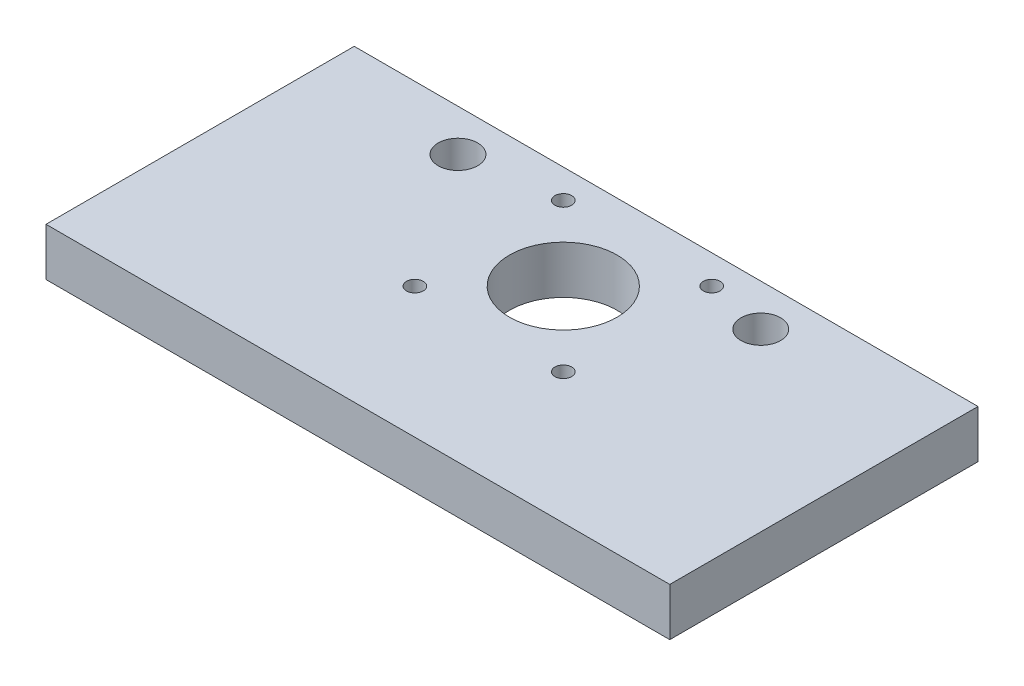
ISO-10303-21;
HEADER;
FILE_DESCRIPTION(('STEP AP214'),'2;1');
FILE_NAME('part.step','',(''),(''),'','','');
FILE_SCHEMA(('AUTOMOTIVE_DESIGN { 1 0 10303 214 1 1 1 1 }'));
ENDSEC;
DATA;
#1=APPLICATION_CONTEXT('core data for automotive mechanical design processes');
#2=APPLICATION_PROTOCOL_DEFINITION('international standard','automotive_design',2000,#1);
#3=PRODUCT_CONTEXT('',#1,'mechanical');
#4=PRODUCT('Part','Part','',(#3));
#5=PRODUCT_RELATED_PRODUCT_CATEGORY('part','',(#4));
#6=PRODUCT_DEFINITION_FORMATION('','',#4);
#7=PRODUCT_DEFINITION_CONTEXT('part definition',#1,'design');
#8=PRODUCT_DEFINITION('design','',#6,#7);
#9=PRODUCT_DEFINITION_SHAPE('','',#8);
#10=(LENGTH_UNIT() NAMED_UNIT(*) SI_UNIT(.MILLI.,.METRE.));
#11=(NAMED_UNIT(*) PLANE_ANGLE_UNIT() SI_UNIT($,.RADIAN.));
#12=(NAMED_UNIT(*) SI_UNIT($,.STERADIAN.) SOLID_ANGLE_UNIT());
#13=UNCERTAINTY_MEASURE_WITH_UNIT(LENGTH_MEASURE(1.E-05),#10,'distance_accuracy_value','');
#14=(GEOMETRIC_REPRESENTATION_CONTEXT(3) GLOBAL_UNCERTAINTY_ASSIGNED_CONTEXT((#13)) GLOBAL_UNIT_ASSIGNED_CONTEXT((#10,
#11,#12)) REPRESENTATION_CONTEXT('',''));
#15=CARTESIAN_POINT('',(0.,0.,0.));
#16=DIRECTION('',(0.,0.,1.));
#17=DIRECTION('',(1.,0.,0.));
#18=AXIS2_PLACEMENT_3D('',#15,#16,#17);
#19=CARTESIAN_POINT('',(0.,10.,-64.3890688986506));
#20=DIRECTION('',(0.,-1.,0.));
#21=DIRECTION('',(0.,0.,-1.));
#22=AXIS2_PLACEMENT_3D('',#19,#20,#21);
#23=PLANE('',#22);
#24=CARTESIAN_POINT('',(30.3812663961431,10.,-55.6797693556538));
#25=DIRECTION('',(0.,1.,0.));
#26=DIRECTION('',(0.,0.,1.));
#27=AXIS2_PLACEMENT_3D('',#24,#25,#26);
#28=CIRCLE('',#27,4.13181922048026);
#29=CARTESIAN_POINT('',(30.3812663961431,10.,-51.5479501351735));
#30=VERTEX_POINT('',#29);
#31=EDGE_CURVE('E137',#30,#30,#28,.T.);
#32=ORIENTED_EDGE('',*,*,#31,.F.);
#33=EDGE_LOOP('',(#32));
#34=FACE_BOUND('',#33,.T.);
#35=CARTESIAN_POINT('',(80.7184645681301,10.,-27.3450121343954));
#36=DIRECTION('',(0.,1.,0.));
#37=DIRECTION('',(0.,0.,1.));
#38=AXIS2_PLACEMENT_3D('',#35,#36,#37);
#39=CIRCLE('',#38,1.75);
#40=CARTESIAN_POINT('',(80.7184645681301,10.,-25.5950121343954));
#41=VERTEX_POINT('',#40);
#42=EDGE_CURVE('E125',#41,#41,#39,.T.);
#43=ORIENTED_EDGE('',*,*,#42,.F.);
#44=EDGE_LOOP('',(#43));
#45=FACE_BOUND('',#44,.T.);
#46=CARTESIAN_POINT('',(80.7184645681301,10.,-58.3450121343954));
#47=DIRECTION('',(0.,1.,0.));
#48=DIRECTION('',(0.,0.,1.));
#49=AXIS2_PLACEMENT_3D('',#46,#47,#48);
#50=CIRCLE('',#49,1.75);
#51=CARTESIAN_POINT('',(80.7184645681301,10.,-56.5950121343954));
#52=VERTEX_POINT('',#51);
#53=EDGE_CURVE('E113',#52,#52,#50,.T.);
#54=ORIENTED_EDGE('',*,*,#53,.F.);
#55=EDGE_LOOP('',(#54));
#56=FACE_BOUND('',#55,.T.);
#57=DIRECTION('',(0.,0.,1.));
#58=VECTOR('',#57,1.);
#59=CARTESIAN_POINT('',(0.,10.,0.));
#60=LINE('',#59,#58);
#61=CARTESIAN_POINT('',(0.,10.,-64.3890688986506));
#62=VERTEX_POINT('',#61);
#63=CARTESIAN_POINT('',(0.,10.,0.));
#64=VERTEX_POINT('',#63);
#65=EDGE_CURVE('E83',#62,#64,#60,.T.);
#66=ORIENTED_EDGE('',*,*,#65,.T.);
#67=DIRECTION('',(1.,0.,0.));
#68=VECTOR('',#67,1.);
#69=CARTESIAN_POINT('',(0.,10.,0.));
#70=LINE('',#69,#68);
#71=CARTESIAN_POINT('',(130.309019047369,10.,0.));
#72=VERTEX_POINT('',#71);
#73=EDGE_CURVE('E78',#64,#72,#70,.T.);
#74=ORIENTED_EDGE('',*,*,#73,.T.);
#75=DIRECTION('',(0.,0.,-1.));
#76=VECTOR('',#75,1.);
#77=CARTESIAN_POINT('',(130.309019047369,10.,0.));
#78=LINE('',#77,#76);
#79=CARTESIAN_POINT('',(130.309019047369,10.,-64.3890688986506));
#80=VERTEX_POINT('',#79);
#81=EDGE_CURVE('E81',#72,#80,#78,.T.);
#82=ORIENTED_EDGE('',*,*,#81,.T.);
#83=DIRECTION('',(-1.,0.,0.));
#84=VECTOR('',#83,1.);
#85=CARTESIAN_POINT('',(0.,10.,-64.3890688986506));
#86=LINE('',#85,#84);
#87=EDGE_CURVE('E48',#80,#62,#86,.T.);
#88=ORIENTED_EDGE('',*,*,#87,.T.);
#89=EDGE_LOOP('',(#66,#74,#82,#88));
#90=FACE_BOUND('',#89,.T.);
#91=CARTESIAN_POINT('',(49.7184645681301,10.,-58.3450121343954));
#92=DIRECTION('',(0.,1.,0.));
#93=DIRECTION('',(0.,0.,1.));
#94=AXIS2_PLACEMENT_3D('',#91,#92,#93);
#95=CIRCLE('',#94,1.75);
#96=CARTESIAN_POINT('',(49.7184645681301,10.,-56.5950121343954));
#97=VERTEX_POINT('',#96);
#98=EDGE_CURVE('E98',#97,#97,#95,.T.);
#99=ORIENTED_EDGE('',*,*,#98,.F.);
#100=EDGE_LOOP('',(#99));
#101=FACE_BOUND('',#100,.T.);
#102=CARTESIAN_POINT('',(49.7184645681301,10.,-27.3450121343954));
#103=DIRECTION('',(0.,1.,0.));
#104=DIRECTION('',(0.,0.,1.));
#105=AXIS2_PLACEMENT_3D('',#102,#103,#104);
#106=CIRCLE('',#105,1.75);
#107=CARTESIAN_POINT('',(49.7184645681301,10.,-25.5950121343954));
#108=VERTEX_POINT('',#107);
#109=EDGE_CURVE('E119',#108,#108,#106,.T.);
#110=ORIENTED_EDGE('',*,*,#109,.F.);
#111=EDGE_LOOP('',(#110));
#112=FACE_BOUND('',#111,.T.);
#113=CARTESIAN_POINT('',(65.2184645681301,10.,-42.8450121343954));
#114=DIRECTION('',(0.,1.,0.));
#115=DIRECTION('',(0.,0.,1.));
#116=AXIS2_PLACEMENT_3D('',#113,#114,#115);
#117=CIRCLE('',#116,11.25);
#118=CARTESIAN_POINT('',(65.2184645681301,10.,-31.5950121343954));
#119=VERTEX_POINT('',#118);
#120=EDGE_CURVE('E131',#119,#119,#117,.T.);
#121=ORIENTED_EDGE('',*,*,#120,.F.);
#122=EDGE_LOOP('',(#121));
#123=FACE_BOUND('',#122,.T.);
#124=CARTESIAN_POINT('',(93.638284129488,10.,-55.6797693556538));
#125=DIRECTION('',(0.,1.,0.));
#126=DIRECTION('',(0.,0.,1.));
#127=AXIS2_PLACEMENT_3D('',#124,#125,#126);
#128=CIRCLE('',#127,4.13181922048026);
#129=CARTESIAN_POINT('',(93.638284129488,10.,-51.5479501351735));
#130=VERTEX_POINT('',#129);
#131=EDGE_CURVE('E143',#130,#130,#128,.T.);
#132=ORIENTED_EDGE('',*,*,#131,.F.);
#133=EDGE_LOOP('',(#132));
#134=FACE_BOUND('',#133,.T.);
#135=ADVANCED_FACE('F31',(#34,#45,#56,#90,#101,#112,#123,#134),#23,.F.);
#136=CARTESIAN_POINT('',(0.,0.,-64.3890688986506));
#137=DIRECTION('',(0.,-1.,0.));
#138=DIRECTION('',(0.,0.,-1.));
#139=AXIS2_PLACEMENT_3D('',#136,#137,#138);
#140=PLANE('',#139);
#141=CARTESIAN_POINT('',(30.3812663961431,0.,-55.6797693556538));
#142=DIRECTION('',(0.,1.,0.));
#143=DIRECTION('',(0.,0.,1.));
#144=AXIS2_PLACEMENT_3D('',#141,#142,#143);
#145=CIRCLE('',#144,4.13181922048026);
#146=CARTESIAN_POINT('',(30.3812663961431,0.,-51.5479501351735));
#147=VERTEX_POINT('',#146);
#148=EDGE_CURVE('E140',#147,#147,#145,.T.);
#149=ORIENTED_EDGE('',*,*,#148,.T.);
#150=EDGE_LOOP('',(#149));
#151=FACE_BOUND('',#150,.T.);
#152=CARTESIAN_POINT('',(80.7184645681301,0.,-27.3450121343954));
#153=DIRECTION('',(0.,1.,0.));
#154=DIRECTION('',(0.,0.,1.));
#155=AXIS2_PLACEMENT_3D('',#152,#153,#154);
#156=CIRCLE('',#155,1.75);
#157=CARTESIAN_POINT('',(80.7184645681301,0.,-25.5950121343954));
#158=VERTEX_POINT('',#157);
#159=EDGE_CURVE('E128',#158,#158,#156,.T.);
#160=ORIENTED_EDGE('',*,*,#159,.T.);
#161=EDGE_LOOP('',(#160));
#162=FACE_BOUND('',#161,.T.);
#163=CARTESIAN_POINT('',(80.7184645681301,0.,-58.3450121343954));
#164=DIRECTION('',(0.,1.,0.));
#165=DIRECTION('',(0.,0.,1.));
#166=AXIS2_PLACEMENT_3D('',#163,#164,#165);
#167=CIRCLE('',#166,1.75);
#168=CARTESIAN_POINT('',(80.7184645681301,0.,-56.5950121343954));
#169=VERTEX_POINT('',#168);
#170=EDGE_CURVE('E116',#169,#169,#167,.T.);
#171=ORIENTED_EDGE('',*,*,#170,.T.);
#172=EDGE_LOOP('',(#171));
#173=FACE_BOUND('',#172,.T.);
#174=DIRECTION('',(0.,0.,1.));
#175=VECTOR('',#174,1.);
#176=CARTESIAN_POINT('',(0.,0.,0.));
#177=LINE('',#176,#175);
#178=CARTESIAN_POINT('',(0.,0.,-64.3890688986506));
#179=VERTEX_POINT('',#178);
#180=CARTESIAN_POINT('',(0.,0.,0.));
#181=VERTEX_POINT('',#180);
#182=EDGE_CURVE('E95',#179,#181,#177,.T.);
#183=ORIENTED_EDGE('',*,*,#182,.F.);
#184=DIRECTION('',(-1.,0.,0.));
#185=VECTOR('',#184,1.);
#186=CARTESIAN_POINT('',(0.,0.,-64.3890688986506));
#187=LINE('',#186,#185);
#188=CARTESIAN_POINT('',(130.309019047369,0.,-64.3890688986506));
#189=VERTEX_POINT('',#188);
#190=EDGE_CURVE('E71',#189,#179,#187,.T.);
#191=ORIENTED_EDGE('',*,*,#190,.F.);
#192=DIRECTION('',(0.,0.,-1.));
#193=VECTOR('',#192,1.);
#194=CARTESIAN_POINT('',(130.309019047369,0.,0.));
#195=LINE('',#194,#193);
#196=CARTESIAN_POINT('',(130.309019047369,0.,0.));
#197=VERTEX_POINT('',#196);
#198=EDGE_CURVE('E65',#197,#189,#195,.T.);
#199=ORIENTED_EDGE('',*,*,#198,.F.);
#200=DIRECTION('',(1.,0.,0.));
#201=VECTOR('',#200,1.);
#202=CARTESIAN_POINT('',(0.,0.,0.));
#203=LINE('',#202,#201);
#204=EDGE_CURVE('E87',#181,#197,#203,.T.);
#205=ORIENTED_EDGE('',*,*,#204,.F.);
#206=EDGE_LOOP('',(#183,#191,#199,#205));
#207=FACE_BOUND('',#206,.T.);
#208=CARTESIAN_POINT('',(49.7184645681301,0.,-58.3450121343954));
#209=DIRECTION('',(0.,1.,0.));
#210=DIRECTION('',(0.,0.,1.));
#211=AXIS2_PLACEMENT_3D('',#208,#209,#210);
#212=CIRCLE('',#211,1.75);
#213=CARTESIAN_POINT('',(49.7184645681301,0.,-56.5950121343954));
#214=VERTEX_POINT('',#213);
#215=EDGE_CURVE('E110',#214,#214,#212,.T.);
#216=ORIENTED_EDGE('',*,*,#215,.T.);
#217=EDGE_LOOP('',(#216));
#218=FACE_BOUND('',#217,.T.);
#219=CARTESIAN_POINT('',(49.7184645681301,0.,-27.3450121343954));
#220=DIRECTION('',(0.,1.,0.));
#221=DIRECTION('',(0.,0.,1.));
#222=AXIS2_PLACEMENT_3D('',#219,#220,#221);
#223=CIRCLE('',#222,1.75);
#224=CARTESIAN_POINT('',(49.7184645681301,0.,-25.5950121343954));
#225=VERTEX_POINT('',#224);
#226=EDGE_CURVE('E122',#225,#225,#223,.T.);
#227=ORIENTED_EDGE('',*,*,#226,.T.);
#228=EDGE_LOOP('',(#227));
#229=FACE_BOUND('',#228,.T.);
#230=CARTESIAN_POINT('',(65.2184645681301,0.,-42.8450121343954));
#231=DIRECTION('',(0.,1.,0.));
#232=DIRECTION('',(0.,0.,1.));
#233=AXIS2_PLACEMENT_3D('',#230,#231,#232);
#234=CIRCLE('',#233,11.25);
#235=CARTESIAN_POINT('',(65.2184645681301,0.,-31.5950121343954));
#236=VERTEX_POINT('',#235);
#237=EDGE_CURVE('E134',#236,#236,#234,.T.);
#238=ORIENTED_EDGE('',*,*,#237,.T.);
#239=EDGE_LOOP('',(#238));
#240=FACE_BOUND('',#239,.T.);
#241=CARTESIAN_POINT('',(93.638284129488,0.,-55.6797693556538));
#242=DIRECTION('',(0.,1.,0.));
#243=DIRECTION('',(0.,0.,1.));
#244=AXIS2_PLACEMENT_3D('',#241,#242,#243);
#245=CIRCLE('',#244,4.13181922048026);
#246=CARTESIAN_POINT('',(93.638284129488,0.,-51.5479501351735));
#247=VERTEX_POINT('',#246);
#248=EDGE_CURVE('E146',#247,#247,#245,.T.);
#249=ORIENTED_EDGE('',*,*,#248,.T.);
#250=EDGE_LOOP('',(#249));
#251=FACE_BOUND('',#250,.T.);
#252=ADVANCED_FACE('F106',(#151,#162,#173,#207,#218,#229,#240,#251),#140,.T.);
#253=CARTESIAN_POINT('',(0.,10.,0.));
#254=DIRECTION('',(1.,0.,0.));
#255=DIRECTION('',(0.,0.,-1.));
#256=AXIS2_PLACEMENT_3D('',#253,#254,#255);
#257=PLANE('',#256);
#258=ORIENTED_EDGE('',*,*,#182,.T.);
#259=DIRECTION('',(0.,-1.,0.));
#260=VECTOR('',#259,1.);
#261=CARTESIAN_POINT('',(0.,10.,0.));
#262=LINE('',#261,#260);
#263=EDGE_CURVE('E11',#64,#181,#262,.T.);
#264=ORIENTED_EDGE('',*,*,#263,.F.);
#265=ORIENTED_EDGE('',*,*,#65,.F.);
#266=DIRECTION('',(0.,-1.,0.));
#267=VECTOR('',#266,1.);
#268=CARTESIAN_POINT('',(0.,10.,-64.3890688986506));
#269=LINE('',#268,#267);
#270=EDGE_CURVE('E91',#62,#179,#269,.T.);
#271=ORIENTED_EDGE('',*,*,#270,.T.);
#272=EDGE_LOOP('',(#258,#264,#265,#271));
#273=FACE_BOUND('',#272,.T.);
#274=ADVANCED_FACE('F33',(#273),#257,.F.);
#275=CARTESIAN_POINT('',(0.,10.,0.));
#276=DIRECTION('',(0.,0.,-1.));
#277=DIRECTION('',(-1.,0.,0.));
#278=AXIS2_PLACEMENT_3D('',#275,#276,#277);
#279=PLANE('',#278);
#280=ORIENTED_EDGE('',*,*,#204,.T.);
#281=DIRECTION('',(0.,-1.,0.));
#282=VECTOR('',#281,1.);
#283=CARTESIAN_POINT('',(130.309019047369,10.,0.));
#284=LINE('',#283,#282);
#285=EDGE_CURVE('E40',#72,#197,#284,.T.);
#286=ORIENTED_EDGE('',*,*,#285,.F.);
#287=ORIENTED_EDGE('',*,*,#73,.F.);
#288=ORIENTED_EDGE('',*,*,#263,.T.);
#289=EDGE_LOOP('',(#280,#286,#287,#288));
#290=FACE_BOUND('',#289,.T.);
#291=ADVANCED_FACE('F86',(#290),#279,.F.);
#292=CARTESIAN_POINT('',(130.309019047369,10.,0.));
#293=DIRECTION('',(-1.,0.,0.));
#294=DIRECTION('',(0.,0.,1.));
#295=AXIS2_PLACEMENT_3D('',#292,#293,#294);
#296=PLANE('',#295);
#297=ORIENTED_EDGE('',*,*,#198,.T.);
#298=DIRECTION('',(0.,-1.,0.));
#299=VECTOR('',#298,1.);
#300=CARTESIAN_POINT('',(130.309019047369,10.,-64.3890688986506));
#301=LINE('',#300,#299);
#302=EDGE_CURVE('E88',#80,#189,#301,.T.);
#303=ORIENTED_EDGE('',*,*,#302,.F.);
#304=ORIENTED_EDGE('',*,*,#81,.F.);
#305=ORIENTED_EDGE('',*,*,#285,.T.);
#306=EDGE_LOOP('',(#297,#303,#304,#305));
#307=FACE_BOUND('',#306,.T.);
#308=ADVANCED_FACE('F89',(#307),#296,.F.);
#309=CARTESIAN_POINT('',(0.,10.,-64.3890688986506));
#310=DIRECTION('',(0.,0.,1.));
#311=DIRECTION('',(1.,0.,0.));
#312=AXIS2_PLACEMENT_3D('',#309,#310,#311);
#313=PLANE('',#312);
#314=ORIENTED_EDGE('',*,*,#190,.T.);
#315=ORIENTED_EDGE('',*,*,#270,.F.);
#316=ORIENTED_EDGE('',*,*,#87,.F.);
#317=ORIENTED_EDGE('',*,*,#302,.T.);
#318=EDGE_LOOP('',(#314,#315,#316,#317));
#319=FACE_BOUND('',#318,.T.);
#320=ADVANCED_FACE('F103',(#319),#313,.F.);
#321=CARTESIAN_POINT('',(49.7184645681301,10.,-58.3450121343954));
#322=DIRECTION('',(0.,-1.,0.));
#323=DIRECTION('',(0.,0.,-1.));
#324=AXIS2_PLACEMENT_3D('',#321,#322,#323);
#325=CYLINDRICAL_SURFACE('',#324,1.75);
#326=ORIENTED_EDGE('',*,*,#98,.T.);
#327=EDGE_LOOP('',(#326));
#328=FACE_BOUND('',#327,.T.);
#329=ORIENTED_EDGE('',*,*,#215,.F.);
#330=EDGE_LOOP('',(#329));
#331=FACE_BOUND('',#330,.T.);
#332=ADVANCED_FACE('F166',(#328,#331),#325,.F.);
#333=CARTESIAN_POINT('',(80.7184645681301,10.,-58.3450121343954));
#334=DIRECTION('',(0.,-1.,0.));
#335=DIRECTION('',(0.,0.,-1.));
#336=AXIS2_PLACEMENT_3D('',#333,#334,#335);
#337=CYLINDRICAL_SURFACE('',#336,1.75);
#338=ORIENTED_EDGE('',*,*,#53,.T.);
#339=EDGE_LOOP('',(#338));
#340=FACE_BOUND('',#339,.T.);
#341=ORIENTED_EDGE('',*,*,#170,.F.);
#342=EDGE_LOOP('',(#341));
#343=FACE_BOUND('',#342,.T.);
#344=ADVANCED_FACE('F212',(#340,#343),#337,.F.);
#345=CARTESIAN_POINT('',(49.7184645681301,10.,-27.3450121343954));
#346=DIRECTION('',(0.,-1.,0.));
#347=DIRECTION('',(0.,0.,-1.));
#348=AXIS2_PLACEMENT_3D('',#345,#346,#347);
#349=CYLINDRICAL_SURFACE('',#348,1.75);
#350=ORIENTED_EDGE('',*,*,#109,.T.);
#351=EDGE_LOOP('',(#350));
#352=FACE_BOUND('',#351,.T.);
#353=ORIENTED_EDGE('',*,*,#226,.F.);
#354=EDGE_LOOP('',(#353));
#355=FACE_BOUND('',#354,.T.);
#356=ADVANCED_FACE('F220',(#352,#355),#349,.F.);
#357=CARTESIAN_POINT('',(80.7184645681301,10.,-27.3450121343954));
#358=DIRECTION('',(0.,-1.,0.));
#359=DIRECTION('',(0.,0.,-1.));
#360=AXIS2_PLACEMENT_3D('',#357,#358,#359);
#361=CYLINDRICAL_SURFACE('',#360,1.75);
#362=ORIENTED_EDGE('',*,*,#42,.T.);
#363=EDGE_LOOP('',(#362));
#364=FACE_BOUND('',#363,.T.);
#365=ORIENTED_EDGE('',*,*,#159,.F.);
#366=EDGE_LOOP('',(#365));
#367=FACE_BOUND('',#366,.T.);
#368=ADVANCED_FACE('F228',(#364,#367),#361,.F.);
#369=CARTESIAN_POINT('',(65.2184645681301,10.,-42.8450121343954));
#370=DIRECTION('',(0.,-1.,0.));
#371=DIRECTION('',(0.,0.,-1.));
#372=AXIS2_PLACEMENT_3D('',#369,#370,#371);
#373=CYLINDRICAL_SURFACE('',#372,11.25);
#374=ORIENTED_EDGE('',*,*,#120,.T.);
#375=EDGE_LOOP('',(#374));
#376=FACE_BOUND('',#375,.T.);
#377=ORIENTED_EDGE('',*,*,#237,.F.);
#378=EDGE_LOOP('',(#377));
#379=FACE_BOUND('',#378,.T.);
#380=ADVANCED_FACE('F237',(#376,#379),#373,.F.);
#381=CARTESIAN_POINT('',(30.3812663961431,10.,-55.6797693556538));
#382=DIRECTION('',(0.,-1.,0.));
#383=DIRECTION('',(0.,0.,-1.));
#384=AXIS2_PLACEMENT_3D('',#381,#382,#383);
#385=CYLINDRICAL_SURFACE('',#384,4.13181922048026);
#386=ORIENTED_EDGE('',*,*,#31,.T.);
#387=EDGE_LOOP('',(#386));
#388=FACE_BOUND('',#387,.T.);
#389=ORIENTED_EDGE('',*,*,#148,.F.);
#390=EDGE_LOOP('',(#389));
#391=FACE_BOUND('',#390,.T.);
#392=ADVANCED_FACE('F246',(#388,#391),#385,.F.);
#393=CARTESIAN_POINT('',(93.638284129488,10.,-55.6797693556538));
#394=DIRECTION('',(0.,-1.,0.));
#395=DIRECTION('',(0.,0.,-1.));
#396=AXIS2_PLACEMENT_3D('',#393,#394,#395);
#397=CYLINDRICAL_SURFACE('',#396,4.13181922048026);
#398=ORIENTED_EDGE('',*,*,#131,.T.);
#399=EDGE_LOOP('',(#398));
#400=FACE_BOUND('',#399,.T.);
#401=ORIENTED_EDGE('',*,*,#248,.F.);
#402=EDGE_LOOP('',(#401));
#403=FACE_BOUND('',#402,.T.);
#404=ADVANCED_FACE('F152',(#400,#403),#397,.F.);
#405=CLOSED_SHELL('',(#135,#252,#274,#291,#308,#320,#332,#344,#356,#368,#380,#392,#404));
#406=MANIFOLD_SOLID_BREP('B2',#405);
#407=ADVANCED_BREP_SHAPE_REPRESENTATION('',(#18,#406),#14);
#408=SHAPE_DEFINITION_REPRESENTATION(#9,#407);
ENDSEC;
END-ISO-10303-21;
